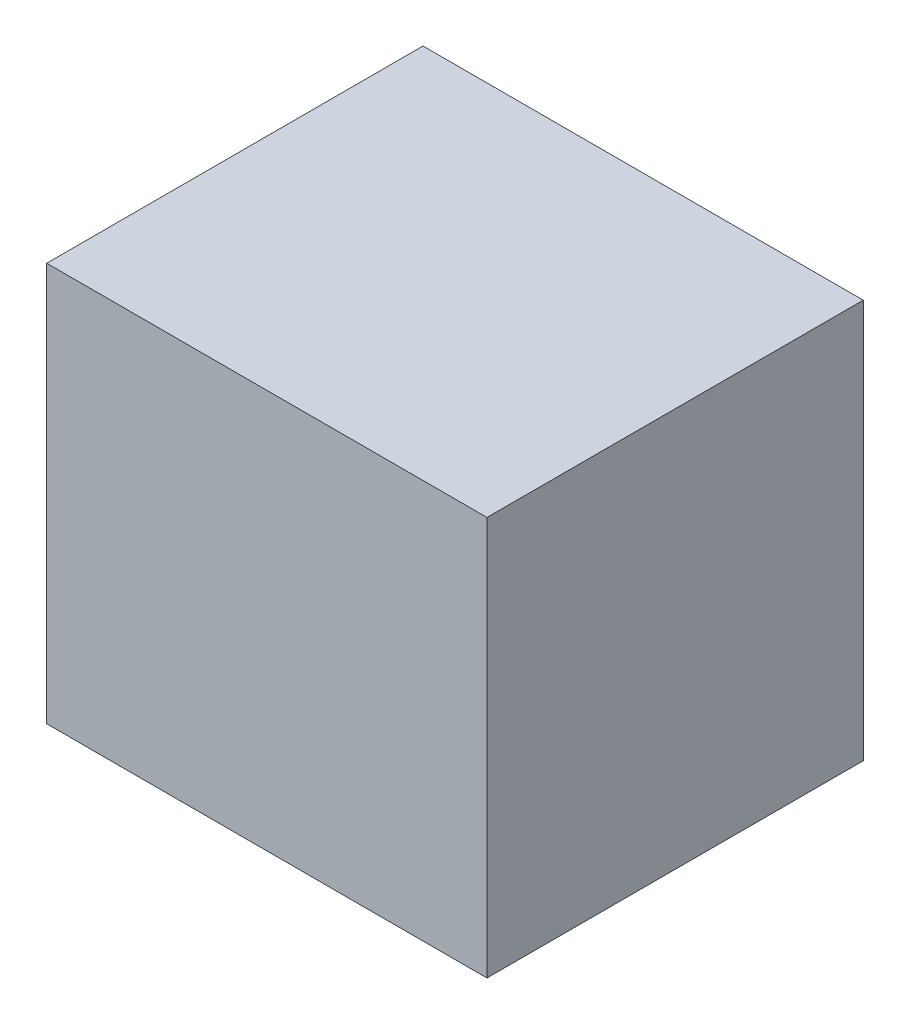
ISO-10303-21;
HEADER;
FILE_DESCRIPTION(('STEP AP214'),'2;1');
FILE_NAME('part.step','',(''),(''),'','','');
FILE_SCHEMA(('AUTOMOTIVE_DESIGN { 1 0 10303 214 1 1 1 1 }'));
ENDSEC;
DATA;
#1=APPLICATION_CONTEXT('core data for automotive mechanical design processes');
#2=APPLICATION_PROTOCOL_DEFINITION('international standard','automotive_design',2000,#1);
#3=PRODUCT_CONTEXT('',#1,'mechanical');
#4=PRODUCT('Part','Part','',(#3));
#5=PRODUCT_RELATED_PRODUCT_CATEGORY('part','',(#4));
#6=PRODUCT_DEFINITION_FORMATION('','',#4);
#7=PRODUCT_DEFINITION_CONTEXT('part definition',#1,'design');
#8=PRODUCT_DEFINITION('design','',#6,#7);
#9=PRODUCT_DEFINITION_SHAPE('','',#8);
#10=(LENGTH_UNIT() NAMED_UNIT(*) SI_UNIT(.MILLI.,.METRE.));
#11=(NAMED_UNIT(*) PLANE_ANGLE_UNIT() SI_UNIT($,.RADIAN.));
#12=(NAMED_UNIT(*) SI_UNIT($,.STERADIAN.) SOLID_ANGLE_UNIT());
#13=UNCERTAINTY_MEASURE_WITH_UNIT(LENGTH_MEASURE(1.E-05),#10,'distance_accuracy_value','');
#14=(GEOMETRIC_REPRESENTATION_CONTEXT(3) GLOBAL_UNCERTAINTY_ASSIGNED_CONTEXT((#13)) GLOBAL_UNIT_ASSIGNED_CONTEXT((#10,
#11,#12)) REPRESENTATION_CONTEXT('',''));
#15=CARTESIAN_POINT('',(0.,0.,0.));
#16=DIRECTION('',(0.,0.,1.));
#17=DIRECTION('',(1.,0.,0.));
#18=AXIS2_PLACEMENT_3D('',#15,#16,#17);
#19=CARTESIAN_POINT('',(-1.528318,1.4478,2.54));
#20=DIRECTION('',(1.,0.,0.));
#21=DIRECTION('',(0.,0.,-1.));
#22=AXIS2_PLACEMENT_3D('',#19,#20,#21);
#23=PLANE('',#22);
#24=DIRECTION('',(0.,-1.,0.));
#25=VECTOR('',#24,1.);
#26=CARTESIAN_POINT('',(-1.528318,1.4478,0.));
#27=LINE('',#26,#25);
#28=CARTESIAN_POINT('',(-1.528318,1.4478,0.));
#29=VERTEX_POINT('',#28);
#30=CARTESIAN_POINT('',(-1.528318,-1.2446,0.));
#31=VERTEX_POINT('',#30);
#32=EDGE_CURVE('E95',#29,#31,#27,.T.);
#33=ORIENTED_EDGE('',*,*,#32,.T.);
#34=DIRECTION('',(0.,0.,-1.));
#35=VECTOR('',#34,1.);
#36=CARTESIAN_POINT('',(-1.528318,-1.2446,2.54));
#37=LINE('',#36,#35);
#38=CARTESIAN_POINT('',(-1.528318,-1.2446,2.54));
#39=VERTEX_POINT('',#38);
#40=EDGE_CURVE('E11',#39,#31,#37,.T.);
#41=ORIENTED_EDGE('',*,*,#40,.F.);
#42=DIRECTION('',(0.,-1.,0.));
#43=VECTOR('',#42,1.);
#44=CARTESIAN_POINT('',(-1.528318,1.4478,2.54));
#45=LINE('',#44,#43);
#46=CARTESIAN_POINT('',(-1.528318,1.4478,2.54));
#47=VERTEX_POINT('',#46);
#48=EDGE_CURVE('E83',#47,#39,#45,.T.);
#49=ORIENTED_EDGE('',*,*,#48,.F.);
#50=DIRECTION('',(0.,0.,-1.));
#51=VECTOR('',#50,1.);
#52=CARTESIAN_POINT('',(-1.528318,1.4478,2.54));
#53=LINE('',#52,#51);
#54=EDGE_CURVE('E91',#47,#29,#53,.T.);
#55=ORIENTED_EDGE('',*,*,#54,.T.);
#56=EDGE_LOOP('',(#33,#41,#49,#55));
#57=FACE_BOUND('',#56,.T.);
#58=ADVANCED_FACE('F32',(#57),#23,.F.);
#59=CARTESIAN_POINT('',(-1.528318,-1.2446,2.54));
#60=DIRECTION('',(0.,1.,0.));
#61=DIRECTION('',(0.,0.,1.));
#62=AXIS2_PLACEMENT_3D('',#59,#60,#61);
#63=PLANE('',#62);
#64=DIRECTION('',(1.,0.,0.));
#65=VECTOR('',#64,1.);
#66=CARTESIAN_POINT('',(-1.528318,-1.2446,0.));
#67=LINE('',#66,#65);
#68=CARTESIAN_POINT('',(1.443482,-1.2446,0.));
#69=VERTEX_POINT('',#68);
#70=EDGE_CURVE('E87',#31,#69,#67,.T.);
#71=ORIENTED_EDGE('',*,*,#70,.T.);
#72=DIRECTION('',(0.,0.,-1.));
#73=VECTOR('',#72,1.);
#74=CARTESIAN_POINT('',(1.443482,-1.2446,2.54));
#75=LINE('',#74,#73);
#76=CARTESIAN_POINT('',(1.443482,-1.2446,2.54));
#77=VERTEX_POINT('',#76);
#78=EDGE_CURVE('E40',#77,#69,#75,.T.);
#79=ORIENTED_EDGE('',*,*,#78,.F.);
#80=DIRECTION('',(1.,0.,0.));
#81=VECTOR('',#80,1.);
#82=CARTESIAN_POINT('',(-1.528318,-1.2446,2.54));
#83=LINE('',#82,#81);
#84=EDGE_CURVE('E78',#39,#77,#83,.T.);
#85=ORIENTED_EDGE('',*,*,#84,.F.);
#86=ORIENTED_EDGE('',*,*,#40,.T.);
#87=EDGE_LOOP('',(#71,#79,#85,#86));
#88=FACE_BOUND('',#87,.T.);
#89=ADVANCED_FACE('F86',(#88),#63,.F.);
#90=CARTESIAN_POINT('',(1.443482,-1.2446,2.54));
#91=DIRECTION('',(-1.,0.,0.));
#92=DIRECTION('',(0.,0.,1.));
#93=AXIS2_PLACEMENT_3D('',#90,#91,#92);
#94=PLANE('',#93);
#95=DIRECTION('',(0.,1.,0.));
#96=VECTOR('',#95,1.);
#97=CARTESIAN_POINT('',(1.443482,-1.2446,0.));
#98=LINE('',#97,#96);
#99=CARTESIAN_POINT('',(1.443482,1.4478,0.));
#100=VERTEX_POINT('',#99);
#101=EDGE_CURVE('E65',#69,#100,#98,.T.);
#102=ORIENTED_EDGE('',*,*,#101,.T.);
#103=DIRECTION('',(0.,0.,-1.));
#104=VECTOR('',#103,1.);
#105=CARTESIAN_POINT('',(1.443482,1.4478,2.54));
#106=LINE('',#105,#104);
#107=CARTESIAN_POINT('',(1.443482,1.4478,2.54));
#108=VERTEX_POINT('',#107);
#109=EDGE_CURVE('E88',#108,#100,#106,.T.);
#110=ORIENTED_EDGE('',*,*,#109,.F.);
#111=DIRECTION('',(0.,1.,0.));
#112=VECTOR('',#111,1.);
#113=CARTESIAN_POINT('',(1.443482,-1.2446,2.54));
#114=LINE('',#113,#112);
#115=EDGE_CURVE('E81',#77,#108,#114,.T.);
#116=ORIENTED_EDGE('',*,*,#115,.F.);
#117=ORIENTED_EDGE('',*,*,#78,.T.);
#118=EDGE_LOOP('',(#102,#110,#116,#117));
#119=FACE_BOUND('',#118,.T.);
#120=ADVANCED_FACE('F89',(#119),#94,.F.);
#121=CARTESIAN_POINT('',(1.443482,1.4478,2.54));
#122=DIRECTION('',(0.,-1.,0.));
#123=DIRECTION('',(0.,0.,-1.));
#124=AXIS2_PLACEMENT_3D('',#121,#122,#123);
#125=PLANE('',#124);
#126=DIRECTION('',(-1.,0.,0.));
#127=VECTOR('',#126,1.);
#128=CARTESIAN_POINT('',(1.443482,1.4478,0.));
#129=LINE('',#128,#127);
#130=EDGE_CURVE('E71',#100,#29,#129,.T.);
#131=ORIENTED_EDGE('',*,*,#130,.T.);
#132=ORIENTED_EDGE('',*,*,#54,.F.);
#133=DIRECTION('',(-1.,0.,0.));
#134=VECTOR('',#133,1.);
#135=CARTESIAN_POINT('',(1.443482,1.4478,2.54));
#136=LINE('',#135,#134);
#137=EDGE_CURVE('E48',#108,#47,#136,.T.);
#138=ORIENTED_EDGE('',*,*,#137,.F.);
#139=ORIENTED_EDGE('',*,*,#109,.T.);
#140=EDGE_LOOP('',(#131,#132,#138,#139));
#141=FACE_BOUND('',#140,.T.);
#142=ADVANCED_FACE('F102',(#141),#125,.F.);
#143=CARTESIAN_POINT('',(0.,0.,2.54));
#144=DIRECTION('',(0.,0.,1.));
#145=DIRECTION('',(1.,0.,0.));
#146=AXIS2_PLACEMENT_3D('',#143,#144,#145);
#147=PLANE('',#146);
#148=ORIENTED_EDGE('',*,*,#48,.T.);
#149=ORIENTED_EDGE('',*,*,#84,.T.);
#150=ORIENTED_EDGE('',*,*,#115,.T.);
#151=ORIENTED_EDGE('',*,*,#137,.T.);
#152=EDGE_LOOP('',(#148,#149,#150,#151));
#153=FACE_BOUND('',#152,.T.);
#154=ADVANCED_FACE('F79',(#153),#147,.T.);
#155=CARTESIAN_POINT('',(0.,0.,0.));
#156=DIRECTION('',(0.,0.,1.));
#157=DIRECTION('',(1.,0.,0.));
#158=AXIS2_PLACEMENT_3D('',#155,#156,#157);
#159=PLANE('',#158);
#160=ORIENTED_EDGE('',*,*,#32,.F.);
#161=ORIENTED_EDGE('',*,*,#130,.F.);
#162=ORIENTED_EDGE('',*,*,#101,.F.);
#163=ORIENTED_EDGE('',*,*,#70,.F.);
#164=EDGE_LOOP('',(#160,#161,#162,#163));
#165=FACE_BOUND('',#164,.T.);
#166=ADVANCED_FACE('F105',(#165),#159,.F.);
#167=CLOSED_SHELL('',(#58,#89,#120,#142,#154,#166));
#168=MANIFOLD_SOLID_BREP('B2',#167);
#169=ADVANCED_BREP_SHAPE_REPRESENTATION('',(#18,#168),#14);
#170=SHAPE_DEFINITION_REPRESENTATION(#9,#169);
ENDSEC;
END-ISO-10303-21;
